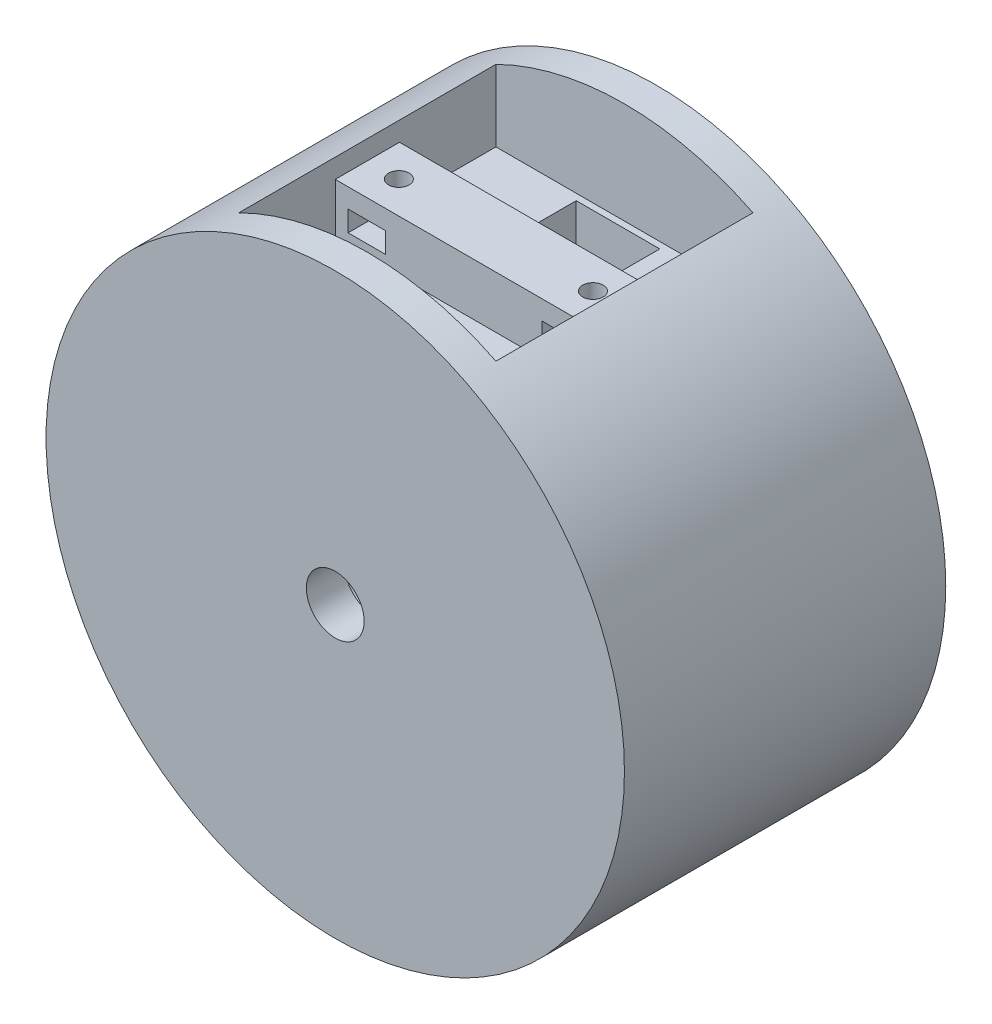
ISO-10303-21;
HEADER;
FILE_DESCRIPTION(('STEP AP214'),'2;1');
FILE_NAME('part.step','',(''),(''),'','','');
FILE_SCHEMA(('AUTOMOTIVE_DESIGN { 1 0 10303 214 1 1 1 1 }'));
ENDSEC;
DATA;
#1=APPLICATION_CONTEXT('core data for automotive mechanical design processes');
#2=APPLICATION_PROTOCOL_DEFINITION('international standard','automotive_design',2000,#1);
#3=PRODUCT_CONTEXT('',#1,'mechanical');
#4=PRODUCT('Part','Part','',(#3));
#5=PRODUCT_RELATED_PRODUCT_CATEGORY('part','',(#4));
#6=PRODUCT_DEFINITION_FORMATION('','',#4);
#7=PRODUCT_DEFINITION_CONTEXT('part definition',#1,'design');
#8=PRODUCT_DEFINITION('design','',#6,#7);
#9=PRODUCT_DEFINITION_SHAPE('','',#8);
#10=(LENGTH_UNIT() NAMED_UNIT(*) SI_UNIT(.MILLI.,.METRE.));
#11=(NAMED_UNIT(*) PLANE_ANGLE_UNIT() SI_UNIT($,.RADIAN.));
#12=(NAMED_UNIT(*) SI_UNIT($,.STERADIAN.) SOLID_ANGLE_UNIT());
#13=UNCERTAINTY_MEASURE_WITH_UNIT(LENGTH_MEASURE(1.E-05),#10,'distance_accuracy_value','');
#14=(GEOMETRIC_REPRESENTATION_CONTEXT(3) GLOBAL_UNCERTAINTY_ASSIGNED_CONTEXT((#13)) GLOBAL_UNIT_ASSIGNED_CONTEXT((#10,
#11,#12)) REPRESENTATION_CONTEXT('',''));
#15=CARTESIAN_POINT('',(0.,0.,0.));
#16=DIRECTION('',(0.,0.,1.));
#17=DIRECTION('',(1.,0.,0.));
#18=AXIS2_PLACEMENT_3D('',#15,#16,#17);
#19=CARTESIAN_POINT('',(0.,0.,50.));
#20=DIRECTION('',(0.,0.,-1.));
#21=DIRECTION('',(-1.,0.,0.));
#22=AXIS2_PLACEMENT_3D('',#19,#20,#21);
#23=CYLINDRICAL_SURFACE('',#22,45.);
#24=CARTESIAN_POINT('',(0.,0.,5.));
#25=DIRECTION('',(0.,0.,-1.));
#26=DIRECTION('',(-1.,0.,0.));
#27=AXIS2_PLACEMENT_3D('',#24,#25,#26);
#28=CIRCLE('',#27,45.);
#29=CARTESIAN_POINT('',(-20.,40.3112887414927,5.));
#30=VERTEX_POINT('',#29);
#31=CARTESIAN_POINT('',(20.,40.3112887414927,5.));
#32=VERTEX_POINT('',#31);
#33=EDGE_CURVE('E11',#30,#32,#28,.T.);
#34=ORIENTED_EDGE('',*,*,#33,.T.);
#35=DIRECTION('',(0.,0.,-1.));
#36=VECTOR('',#35,1.);
#37=CARTESIAN_POINT('',(20.,40.3112887414927,50.));
#38=LINE('',#37,#36);
#39=CARTESIAN_POINT('',(20.,40.3112887414927,45.));
#40=VERTEX_POINT('',#39);
#41=EDGE_CURVE('E396',#32,#40,#38,.F.);
#42=ORIENTED_EDGE('',*,*,#41,.T.);
#43=CARTESIAN_POINT('',(0.,0.,45.));
#44=DIRECTION('',(0.,0.,1.));
#45=DIRECTION('',(1.,0.,0.));
#46=AXIS2_PLACEMENT_3D('',#43,#44,#45);
#47=CIRCLE('',#46,45.);
#48=CARTESIAN_POINT('',(-20.,40.3112887414927,45.));
#49=VERTEX_POINT('',#48);
#50=EDGE_CURVE('E401',#40,#49,#47,.T.);
#51=ORIENTED_EDGE('',*,*,#50,.T.);
#52=DIRECTION('',(0.,0.,-1.));
#53=VECTOR('',#52,1.);
#54=CARTESIAN_POINT('',(-20.,40.3112887414927,50.));
#55=LINE('',#54,#53);
#56=EDGE_CURVE('E41',#49,#30,#55,.T.);
#57=ORIENTED_EDGE('',*,*,#56,.T.);
#58=EDGE_LOOP('',(#34,#42,#51,#57));
#59=FACE_BOUND('',#58,.T.);
#60=CARTESIAN_POINT('',(0.,0.,50.));
#61=DIRECTION('',(0.,0.,1.));
#62=DIRECTION('',(1.,0.,0.));
#63=AXIS2_PLACEMENT_3D('',#60,#61,#62);
#64=CIRCLE('',#63,45.);
#65=CARTESIAN_POINT('',(45.,0.,50.));
#66=VERTEX_POINT('',#65);
#67=EDGE_CURVE('E393',#66,#66,#64,.T.);
#68=ORIENTED_EDGE('',*,*,#67,.F.);
#69=EDGE_LOOP('',(#68));
#70=FACE_BOUND('',#69,.T.);
#71=CARTESIAN_POINT('',(0.,0.,0.));
#72=DIRECTION('',(0.,0.,1.));
#73=DIRECTION('',(1.,0.,0.));
#74=AXIS2_PLACEMENT_3D('',#71,#72,#73);
#75=CIRCLE('',#74,45.);
#76=CARTESIAN_POINT('',(45.,0.,0.));
#77=VERTEX_POINT('',#76);
#78=EDGE_CURVE('E392',#77,#77,#75,.T.);
#79=ORIENTED_EDGE('',*,*,#78,.T.);
#80=EDGE_LOOP('',(#79));
#81=FACE_BOUND('',#80,.T.);
#82=ADVANCED_FACE('F33',(#59,#70,#81),#23,.T.);
#83=CARTESIAN_POINT('',(0.,0.,50.));
#84=DIRECTION('',(0.,0.,1.));
#85=DIRECTION('',(1.,0.,0.));
#86=AXIS2_PLACEMENT_3D('',#83,#84,#85);
#87=PLANE('',#86);
#88=CARTESIAN_POINT('',(0.,0.,50.));
#89=DIRECTION('',(0.,0.,1.));
#90=DIRECTION('',(1.,0.,0.));
#91=AXIS2_PLACEMENT_3D('',#88,#89,#90);
#92=CIRCLE('',#91,4.5);
#93=CARTESIAN_POINT('',(4.5,0.,50.));
#94=VERTEX_POINT('',#93);
#95=EDGE_CURVE('E389',#94,#94,#92,.T.);
#96=ORIENTED_EDGE('',*,*,#95,.F.);
#97=EDGE_LOOP('',(#96));
#98=FACE_BOUND('',#97,.T.);
#99=ORIENTED_EDGE('',*,*,#67,.T.);
#100=EDGE_LOOP('',(#99));
#101=FACE_BOUND('',#100,.T.);
#102=ADVANCED_FACE('F455',(#98,#101),#87,.T.);
#103=CARTESIAN_POINT('',(0.,0.,0.));
#104=DIRECTION('',(0.,0.,1.));
#105=DIRECTION('',(1.,0.,0.));
#106=AXIS2_PLACEMENT_3D('',#103,#104,#105);
#107=PLANE('',#106);
#108=CARTESIAN_POINT('',(0.,0.,0.));
#109=DIRECTION('',(0.,0.,-1.));
#110=DIRECTION('',(-1.,0.,0.));
#111=AXIS2_PLACEMENT_3D('',#108,#109,#110);
#112=CIRCLE('',#111,4.5);
#113=CARTESIAN_POINT('',(-4.5,0.,0.));
#114=VERTEX_POINT('',#113);
#115=EDGE_CURVE('E359',#114,#114,#112,.T.);
#116=ORIENTED_EDGE('',*,*,#115,.F.);
#117=EDGE_LOOP('',(#116));
#118=FACE_BOUND('',#117,.T.);
#119=ORIENTED_EDGE('',*,*,#78,.F.);
#120=EDGE_LOOP('',(#119));
#121=FACE_BOUND('',#120,.T.);
#122=ADVANCED_FACE('F460',(#118,#121),#107,.F.);
#123=CARTESIAN_POINT('',(0.,0.,44.));
#124=DIRECTION('',(0.,0.,1.));
#125=DIRECTION('',(1.,0.,0.));
#126=AXIS2_PLACEMENT_3D('',#123,#124,#125);
#127=CYLINDRICAL_SURFACE('',#126,4.5);
#128=CARTESIAN_POINT('',(0.,0.,44.));
#129=DIRECTION('',(0.,0.,1.));
#130=DIRECTION('',(1.,0.,0.));
#131=AXIS2_PLACEMENT_3D('',#128,#129,#130);
#132=CIRCLE('',#131,4.5);
#133=CARTESIAN_POINT('',(4.5,0.,44.));
#134=VERTEX_POINT('',#133);
#135=EDGE_CURVE('E385',#134,#134,#132,.T.);
#136=ORIENTED_EDGE('',*,*,#135,.F.);
#137=EDGE_LOOP('',(#136));
#138=FACE_BOUND('',#137,.T.);
#139=ORIENTED_EDGE('',*,*,#95,.T.);
#140=EDGE_LOOP('',(#139));
#141=FACE_BOUND('',#140,.T.);
#142=ADVANCED_FACE('F470',(#138,#141),#127,.F.);
#143=CARTESIAN_POINT('',(6.5,7.19,37.));
#144=DIRECTION('',(1.,0.,0.));
#145=DIRECTION('',(0.,0.,-1.));
#146=AXIS2_PLACEMENT_3D('',#143,#144,#145);
#147=PLANE('',#146);
#148=DIRECTION('',(0.,1.,0.));
#149=VECTOR('',#148,1.);
#150=CARTESIAN_POINT('',(6.5,7.19,44.));
#151=LINE('',#150,#149);
#152=CARTESIAN_POINT('',(6.5,-3.07345082927969,44.));
#153=VERTEX_POINT('',#152);
#154=CARTESIAN_POINT('',(6.5,29.19,44.));
#155=VERTEX_POINT('',#154);
#156=EDGE_CURVE('E375',#153,#155,#151,.T.);
#157=ORIENTED_EDGE('',*,*,#156,.T.);
#158=DIRECTION('',(0.,0.,-1.));
#159=VECTOR('',#158,1.);
#160=CARTESIAN_POINT('',(6.5,29.19,44.));
#161=LINE('',#160,#159);
#162=CARTESIAN_POINT('',(6.5,29.19,37.));
#163=VERTEX_POINT('',#162);
#164=EDGE_CURVE('E220',#155,#163,#161,.T.);
#165=ORIENTED_EDGE('',*,*,#164,.T.);
#166=DIRECTION('',(0.,1.,0.));
#167=VECTOR('',#166,1.);
#168=CARTESIAN_POINT('',(6.5,7.19,37.));
#169=LINE('',#168,#167);
#170=CARTESIAN_POINT('',(6.5,-3.07345082927969,37.));
#171=VERTEX_POINT('',#170);
#172=EDGE_CURVE('E378',#171,#163,#169,.T.);
#173=ORIENTED_EDGE('',*,*,#172,.F.);
#174=DIRECTION('',(0.,0.,1.));
#175=VECTOR('',#174,1.);
#176=CARTESIAN_POINT('',(6.5,-3.07345082927969,37.));
#177=LINE('',#176,#175);
#178=EDGE_CURVE('E383',#171,#153,#177,.T.);
#179=ORIENTED_EDGE('',*,*,#178,.T.);
#180=EDGE_LOOP('',(#157,#165,#173,#179));
#181=FACE_BOUND('',#180,.T.);
#182=ADVANCED_FACE('F475',(#181),#147,.F.);
#183=CARTESIAN_POINT('',(0.,0.,37.));
#184=DIRECTION('',(0.,0.,1.));
#185=DIRECTION('',(1.,0.,0.));
#186=AXIS2_PLACEMENT_3D('',#183,#184,#185);
#187=CYLINDRICAL_SURFACE('',#186,7.19);
#188=CARTESIAN_POINT('',(0.,0.,44.));
#189=DIRECTION('',(0.,0.,1.));
#190=DIRECTION('',(1.,0.,0.));
#191=AXIS2_PLACEMENT_3D('',#188,#189,#190);
#192=CIRCLE('',#191,7.19);
#193=CARTESIAN_POINT('',(-6.5,-3.07345082927969,44.));
#194=VERTEX_POINT('',#193);
#195=EDGE_CURVE('E204',#194,#153,#192,.T.);
#196=ORIENTED_EDGE('',*,*,#195,.T.);
#197=ORIENTED_EDGE('',*,*,#178,.F.);
#198=CARTESIAN_POINT('',(0.,0.,37.));
#199=DIRECTION('',(0.,0.,1.));
#200=DIRECTION('',(1.,0.,0.));
#201=AXIS2_PLACEMENT_3D('',#198,#199,#200);
#202=CIRCLE('',#201,7.19);
#203=CARTESIAN_POINT('',(-6.5,-3.07345082927969,37.));
#204=VERTEX_POINT('',#203);
#205=EDGE_CURVE('E374',#204,#171,#202,.T.);
#206=ORIENTED_EDGE('',*,*,#205,.F.);
#207=DIRECTION('',(0.,0.,1.));
#208=VECTOR('',#207,1.);
#209=CARTESIAN_POINT('',(-6.5,-3.07345082927969,37.));
#210=LINE('',#209,#208);
#211=EDGE_CURVE('E379',#204,#194,#210,.T.);
#212=ORIENTED_EDGE('',*,*,#211,.T.);
#213=EDGE_LOOP('',(#196,#197,#206,#212));
#214=FACE_BOUND('',#213,.T.);
#215=ADVANCED_FACE('F483',(#214),#187,.F.);
#216=CARTESIAN_POINT('',(-6.5,-3.07345082927969,37.));
#217=DIRECTION('',(-1.,0.,0.));
#218=DIRECTION('',(0.,0.,1.));
#219=AXIS2_PLACEMENT_3D('',#216,#217,#218);
#220=PLANE('',#219);
#221=DIRECTION('',(0.,-1.,0.));
#222=VECTOR('',#221,1.);
#223=CARTESIAN_POINT('',(-6.5,-3.07345082927969,44.));
#224=LINE('',#223,#222);
#225=CARTESIAN_POINT('',(-6.5,29.19,44.));
#226=VERTEX_POINT('',#225);
#227=EDGE_CURVE('E196',#226,#194,#224,.T.);
#228=ORIENTED_EDGE('',*,*,#227,.T.);
#229=ORIENTED_EDGE('',*,*,#211,.F.);
#230=DIRECTION('',(0.,-1.,0.));
#231=VECTOR('',#230,1.);
#232=CARTESIAN_POINT('',(-6.5,-3.07345082927969,37.));
#233=LINE('',#232,#231);
#234=CARTESIAN_POINT('',(-6.5,29.19,37.));
#235=VERTEX_POINT('',#234);
#236=EDGE_CURVE('E212',#235,#204,#233,.T.);
#237=ORIENTED_EDGE('',*,*,#236,.F.);
#238=DIRECTION('',(0.,0.,1.));
#239=VECTOR('',#238,1.);
#240=CARTESIAN_POINT('',(-6.5,29.19,44.));
#241=LINE('',#240,#239);
#242=EDGE_CURVE('E209',#235,#226,#241,.T.);
#243=ORIENTED_EDGE('',*,*,#242,.T.);
#244=EDGE_LOOP('',(#228,#229,#237,#243));
#245=FACE_BOUND('',#244,.T.);
#246=ADVANCED_FACE('F210',(#245),#220,.F.);
#247=CARTESIAN_POINT('',(0.,0.,37.));
#248=DIRECTION('',(0.,0.,1.));
#249=DIRECTION('',(1.,0.,0.));
#250=AXIS2_PLACEMENT_3D('',#247,#248,#249);
#251=PLANE('',#250);
#252=CARTESIAN_POINT('',(0.,0.,37.));
#253=DIRECTION('',(0.,0.,1.));
#254=DIRECTION('',(1.,0.,0.));
#255=AXIS2_PLACEMENT_3D('',#252,#253,#254);
#256=CIRCLE('',#255,4.5);
#257=CARTESIAN_POINT('',(4.5,0.,37.));
#258=VERTEX_POINT('',#257);
#259=EDGE_CURVE('E428',#258,#258,#256,.T.);
#260=ORIENTED_EDGE('',*,*,#259,.F.);
#261=EDGE_LOOP('',(#260));
#262=FACE_BOUND('',#261,.T.);
#263=ORIENTED_EDGE('',*,*,#172,.T.);
#264=DIRECTION('',(-1.,0.,0.));
#265=VECTOR('',#264,1.);
#266=CARTESIAN_POINT('',(-6.5,29.19,37.));
#267=LINE('',#266,#265);
#268=EDGE_CURVE('E222',#163,#235,#267,.T.);
#269=ORIENTED_EDGE('',*,*,#268,.T.);
#270=ORIENTED_EDGE('',*,*,#236,.T.);
#271=ORIENTED_EDGE('',*,*,#205,.T.);
#272=EDGE_LOOP('',(#263,#269,#270,#271));
#273=FACE_BOUND('',#272,.T.);
#274=ADVANCED_FACE('F482',(#262,#273),#251,.T.);
#275=CARTESIAN_POINT('',(0.,0.,44.));
#276=DIRECTION('',(0.,0.,1.));
#277=DIRECTION('',(1.,0.,0.));
#278=AXIS2_PLACEMENT_3D('',#275,#276,#277);
#279=PLANE('',#278);
#280=ORIENTED_EDGE('',*,*,#135,.T.);
#281=EDGE_LOOP('',(#280));
#282=FACE_BOUND('',#281,.T.);
#283=ORIENTED_EDGE('',*,*,#227,.F.);
#284=DIRECTION('',(1.,0.,0.));
#285=VECTOR('',#284,1.);
#286=CARTESIAN_POINT('',(-6.5,29.19,44.));
#287=LINE('',#286,#285);
#288=EDGE_CURVE('E201',#226,#155,#287,.T.);
#289=ORIENTED_EDGE('',*,*,#288,.T.);
#290=ORIENTED_EDGE('',*,*,#156,.F.);
#291=ORIENTED_EDGE('',*,*,#195,.F.);
#292=EDGE_LOOP('',(#283,#289,#290,#291));
#293=FACE_BOUND('',#292,.T.);
#294=ADVANCED_FACE('F198',(#282,#293),#279,.F.);
#295=CARTESIAN_POINT('',(-20.,48.19,30.));
#296=DIRECTION('',(-1.,0.,0.));
#297=DIRECTION('',(0.,0.,1.));
#298=AXIS2_PLACEMENT_3D('',#295,#296,#297);
#299=PLANE('',#298);
#300=DIRECTION('',(0.,-1.,0.));
#301=VECTOR('',#300,1.);
#302=CARTESIAN_POINT('',(-20.,48.19,45.));
#303=LINE('',#302,#301);
#304=CARTESIAN_POINT('',(-20.,29.19,45.));
#305=VERTEX_POINT('',#304);
#306=EDGE_CURVE('E206',#49,#305,#303,.T.);
#307=ORIENTED_EDGE('',*,*,#306,.T.);
#308=DIRECTION('',(0.,0.,1.));
#309=VECTOR('',#308,1.);
#310=CARTESIAN_POINT('',(-20.,29.19,45.));
#311=LINE('',#310,#309);
#312=CARTESIAN_POINT('',(-20.,29.19,30.));
#313=VERTEX_POINT('',#312);
#314=EDGE_CURVE('E230',#313,#305,#311,.T.);
#315=ORIENTED_EDGE('',*,*,#314,.F.);
#316=DIRECTION('',(0.,-1.,0.));
#317=VECTOR('',#316,1.);
#318=CARTESIAN_POINT('',(-20.,48.19,30.));
#319=LINE('',#318,#317);
#320=CARTESIAN_POINT('',(-20.,37.3112887414927,30.));
#321=VERTEX_POINT('',#320);
#322=EDGE_CURVE('E362',#321,#313,#319,.T.);
#323=ORIENTED_EDGE('',*,*,#322,.F.);
#324=DIRECTION('',(0.,0.,1.));
#325=VECTOR('',#324,1.);
#326=CARTESIAN_POINT('',(-20.,37.3112887414927,-0.001000000000001));
#327=LINE('',#326,#325);
#328=CARTESIAN_POINT('',(-20.,37.3112887414927,20.));
#329=VERTEX_POINT('',#328);
#330=EDGE_CURVE('E318',#329,#321,#327,.T.);
#331=ORIENTED_EDGE('',*,*,#330,.F.);
#332=DIRECTION('',(0.,-1.,0.));
#333=VECTOR('',#332,1.);
#334=CARTESIAN_POINT('',(-20.,54.19,20.));
#335=LINE('',#334,#333);
#336=CARTESIAN_POINT('',(-20.,29.19,20.));
#337=VERTEX_POINT('',#336);
#338=EDGE_CURVE('E332',#329,#337,#335,.T.);
#339=ORIENTED_EDGE('',*,*,#338,.T.);
#340=DIRECTION('',(0.,0.,1.));
#341=VECTOR('',#340,1.);
#342=CARTESIAN_POINT('',(-20.,29.19,5.));
#343=LINE('',#342,#341);
#344=CARTESIAN_POINT('',(-20.,29.19,5.));
#345=VERTEX_POINT('',#344);
#346=EDGE_CURVE('E57',#345,#337,#343,.T.);
#347=ORIENTED_EDGE('',*,*,#346,.F.);
#348=DIRECTION('',(0.,-1.,0.));
#349=VECTOR('',#348,1.);
#350=CARTESIAN_POINT('',(-20.,54.19,5.));
#351=LINE('',#350,#349);
#352=EDGE_CURVE('E329',#30,#345,#351,.T.);
#353=ORIENTED_EDGE('',*,*,#352,.F.);
#354=ORIENTED_EDGE('',*,*,#56,.F.);
#355=EDGE_LOOP('',(#307,#315,#323,#331,#339,#347,#353,#354));
#356=FACE_BOUND('',#355,.T.);
#357=ADVANCED_FACE('F492',(#356),#299,.F.);
#358=CARTESIAN_POINT('',(20.,48.19,45.));
#359=DIRECTION('',(0.,0.,1.));
#360=DIRECTION('',(1.,0.,0.));
#361=AXIS2_PLACEMENT_3D('',#358,#359,#360);
#362=PLANE('',#361);
#363=DIRECTION('',(0.,-1.,0.));
#364=VECTOR('',#363,1.);
#365=CARTESIAN_POINT('',(20.,48.19,45.));
#366=LINE('',#365,#364);
#367=CARTESIAN_POINT('',(20.,29.19,45.));
#368=VERTEX_POINT('',#367);
#369=EDGE_CURVE('E365',#40,#368,#366,.T.);
#370=ORIENTED_EDGE('',*,*,#369,.T.);
#371=DIRECTION('',(1.,0.,0.));
#372=VECTOR('',#371,1.);
#373=CARTESIAN_POINT('',(20.,29.19,45.));
#374=LINE('',#373,#372);
#375=EDGE_CURVE('E232',#305,#368,#374,.T.);
#376=ORIENTED_EDGE('',*,*,#375,.F.);
#377=ORIENTED_EDGE('',*,*,#306,.F.);
#378=ORIENTED_EDGE('',*,*,#50,.F.);
#379=EDGE_LOOP('',(#370,#376,#377,#378));
#380=FACE_BOUND('',#379,.T.);
#381=ADVANCED_FACE('F499',(#380),#362,.F.);
#382=CARTESIAN_POINT('',(20.,48.19,30.));
#383=DIRECTION('',(1.,0.,0.));
#384=DIRECTION('',(0.,0.,-1.));
#385=AXIS2_PLACEMENT_3D('',#382,#383,#384);
#386=PLANE('',#385);
#387=DIRECTION('',(0.,-1.,0.));
#388=VECTOR('',#387,1.);
#389=CARTESIAN_POINT('',(20.,48.19,30.));
#390=LINE('',#389,#388);
#391=CARTESIAN_POINT('',(20.,37.3112887414927,30.));
#392=VERTEX_POINT('',#391);
#393=CARTESIAN_POINT('',(20.,29.19,30.));
#394=VERTEX_POINT('',#393);
#395=EDGE_CURVE('E368',#392,#394,#390,.T.);
#396=ORIENTED_EDGE('',*,*,#395,.T.);
#397=DIRECTION('',(0.,0.,-1.));
#398=VECTOR('',#397,1.);
#399=CARTESIAN_POINT('',(20.,29.19,45.));
#400=LINE('',#399,#398);
#401=EDGE_CURVE('E49',#368,#394,#400,.T.);
#402=ORIENTED_EDGE('',*,*,#401,.F.);
#403=ORIENTED_EDGE('',*,*,#369,.F.);
#404=ORIENTED_EDGE('',*,*,#41,.F.);
#405=DIRECTION('',(0.,-1.,0.));
#406=VECTOR('',#405,1.);
#407=CARTESIAN_POINT('',(20.,54.19,5.));
#408=LINE('',#407,#406);
#409=CARTESIAN_POINT('',(20.,29.19,5.));
#410=VERTEX_POINT('',#409);
#411=EDGE_CURVE('E325',#32,#410,#408,.T.);
#412=ORIENTED_EDGE('',*,*,#411,.T.);
#413=DIRECTION('',(0.,0.,-1.));
#414=VECTOR('',#413,1.);
#415=CARTESIAN_POINT('',(20.,29.19,5.));
#416=LINE('',#415,#414);
#417=CARTESIAN_POINT('',(20.,29.19,20.));
#418=VERTEX_POINT('',#417);
#419=EDGE_CURVE('E249',#418,#410,#416,.T.);
#420=ORIENTED_EDGE('',*,*,#419,.F.);
#421=DIRECTION('',(0.,-1.,0.));
#422=VECTOR('',#421,1.);
#423=CARTESIAN_POINT('',(20.,54.19,20.));
#424=LINE('',#423,#422);
#425=CARTESIAN_POINT('',(20.,37.3112887414927,20.));
#426=VERTEX_POINT('',#425);
#427=EDGE_CURVE('E324',#426,#418,#424,.T.);
#428=ORIENTED_EDGE('',*,*,#427,.F.);
#429=DIRECTION('',(0.,0.,1.));
#430=VECTOR('',#429,1.);
#431=CARTESIAN_POINT('',(20.,37.3112887414927,-0.001000000000001));
#432=LINE('',#431,#430);
#433=EDGE_CURVE('E319',#426,#392,#432,.T.);
#434=ORIENTED_EDGE('',*,*,#433,.T.);
#435=EDGE_LOOP('',(#396,#402,#403,#404,#412,#420,#428,#434));
#436=FACE_BOUND('',#435,.T.);
#437=ADVANCED_FACE('F505',(#436),#386,.F.);
#438=CARTESIAN_POINT('',(20.,48.19,30.));
#439=DIRECTION('',(0.,0.,-1.));
#440=DIRECTION('',(-1.,0.,0.));
#441=AXIS2_PLACEMENT_3D('',#438,#439,#440);
#442=PLANE('',#441);
#443=DIRECTION('',(0.,1.,0.));
#444=VECTOR('',#443,1.);
#445=CARTESIAN_POINT('',(18.,31.1112887414927,30.));
#446=LINE('',#445,#444);
#447=CARTESIAN_POINT('',(18.,31.1112887414927,30.));
#448=VERTEX_POINT('',#447);
#449=CARTESIAN_POINT('',(18.,34.3112887414927,30.));
#450=VERTEX_POINT('',#449);
#451=EDGE_CURVE('E256',#448,#450,#446,.T.);
#452=ORIENTED_EDGE('',*,*,#451,.F.);
#453=DIRECTION('',(1.,0.,0.));
#454=VECTOR('',#453,1.);
#455=CARTESIAN_POINT('',(12.2,31.1112887414927,30.));
#456=LINE('',#455,#454);
#457=CARTESIAN_POINT('',(12.2,31.1112887414927,30.));
#458=VERTEX_POINT('',#457);
#459=EDGE_CURVE('E254',#458,#448,#456,.T.);
#460=ORIENTED_EDGE('',*,*,#459,.F.);
#461=DIRECTION('',(0.,-1.,0.));
#462=VECTOR('',#461,1.);
#463=CARTESIAN_POINT('',(12.2,31.1112887414927,30.));
#464=LINE('',#463,#462);
#465=CARTESIAN_POINT('',(12.2,34.3112887414927,30.));
#466=VERTEX_POINT('',#465);
#467=EDGE_CURVE('E270',#466,#458,#464,.T.);
#468=ORIENTED_EDGE('',*,*,#467,.F.);
#469=DIRECTION('',(-1.,0.,0.));
#470=VECTOR('',#469,1.);
#471=CARTESIAN_POINT('',(12.2,34.3112887414927,30.));
#472=LINE('',#471,#470);
#473=EDGE_CURVE('E273',#450,#466,#472,.T.);
#474=ORIENTED_EDGE('',*,*,#473,.F.);
#475=EDGE_LOOP('',(#452,#460,#468,#474));
#476=FACE_BOUND('',#475,.T.);
#477=DIRECTION('',(0.,1.,0.));
#478=VECTOR('',#477,1.);
#479=CARTESIAN_POINT('',(-12.2,31.1112887414927,30.));
#480=LINE('',#479,#478);
#481=CARTESIAN_POINT('',(-12.2,31.1112887414927,30.));
#482=VERTEX_POINT('',#481);
#483=CARTESIAN_POINT('',(-12.2,34.3112887414927,30.));
#484=VERTEX_POINT('',#483);
#485=EDGE_CURVE('E288',#482,#484,#480,.T.);
#486=ORIENTED_EDGE('',*,*,#485,.F.);
#487=DIRECTION('',(1.,0.,0.));
#488=VECTOR('',#487,1.);
#489=CARTESIAN_POINT('',(-18.,31.1112887414927,30.));
#490=LINE('',#489,#488);
#491=CARTESIAN_POINT('',(-18.,31.1112887414927,30.));
#492=VERTEX_POINT('',#491);
#493=EDGE_CURVE('E253',#492,#482,#490,.T.);
#494=ORIENTED_EDGE('',*,*,#493,.F.);
#495=DIRECTION('',(0.,-1.,0.));
#496=VECTOR('',#495,1.);
#497=CARTESIAN_POINT('',(-18.,31.1112887414927,30.));
#498=LINE('',#497,#496);
#499=CARTESIAN_POINT('',(-18.,34.3112887414927,30.));
#500=VERTEX_POINT('',#499);
#501=EDGE_CURVE('E301',#500,#492,#498,.T.);
#502=ORIENTED_EDGE('',*,*,#501,.F.);
#503=DIRECTION('',(-1.,0.,0.));
#504=VECTOR('',#503,1.);
#505=CARTESIAN_POINT('',(-18.,34.3112887414927,30.));
#506=LINE('',#505,#504);
#507=EDGE_CURVE('E304',#484,#500,#506,.T.);
#508=ORIENTED_EDGE('',*,*,#507,.F.);
#509=EDGE_LOOP('',(#486,#494,#502,#508));
#510=FACE_BOUND('',#509,.T.);
#511=ORIENTED_EDGE('',*,*,#322,.T.);
#512=DIRECTION('',(-1.,0.,0.));
#513=VECTOR('',#512,1.);
#514=CARTESIAN_POINT('',(20.,29.19,30.));
#515=LINE('',#514,#513);
#516=EDGE_CURVE('E228',#394,#313,#515,.T.);
#517=ORIENTED_EDGE('',*,*,#516,.F.);
#518=ORIENTED_EDGE('',*,*,#395,.F.);
#519=DIRECTION('',(1.,0.,0.));
#520=VECTOR('',#519,1.);
#521=CARTESIAN_POINT('',(-20.,37.3112887414927,30.));
#522=LINE('',#521,#520);
#523=EDGE_CURVE('E286',#321,#392,#522,.T.);
#524=ORIENTED_EDGE('',*,*,#523,.F.);
#525=EDGE_LOOP('',(#511,#517,#518,#524));
#526=FACE_BOUND('',#525,.T.);
#527=ADVANCED_FACE('F501',(#476,#510,#526),#442,.F.);
#528=CARTESIAN_POINT('',(0.,0.,6.));
#529=DIRECTION('',(0.,0.,-1.));
#530=DIRECTION('',(-1.,0.,0.));
#531=AXIS2_PLACEMENT_3D('',#528,#529,#530);
#532=CYLINDRICAL_SURFACE('',#531,4.5);
#533=CARTESIAN_POINT('',(0.,0.,6.));
#534=DIRECTION('',(0.,0.,-1.));
#535=DIRECTION('',(-1.,0.,0.));
#536=AXIS2_PLACEMENT_3D('',#533,#534,#535);
#537=CIRCLE('',#536,4.5);
#538=CARTESIAN_POINT('',(-4.5,0.,6.));
#539=VERTEX_POINT('',#538);
#540=EDGE_CURVE('E355',#539,#539,#537,.T.);
#541=ORIENTED_EDGE('',*,*,#540,.F.);
#542=EDGE_LOOP('',(#541));
#543=FACE_BOUND('',#542,.T.);
#544=ORIENTED_EDGE('',*,*,#115,.T.);
#545=EDGE_LOOP('',(#544));
#546=FACE_BOUND('',#545,.T.);
#547=ADVANCED_FACE('F504',(#543,#546),#532,.F.);
#548=CARTESIAN_POINT('',(0.,0.,13.));
#549=DIRECTION('',(0.,0.,-1.));
#550=DIRECTION('',(-1.,0.,0.));
#551=AXIS2_PLACEMENT_3D('',#548,#549,#550);
#552=CYLINDRICAL_SURFACE('',#551,7.19);
#553=CARTESIAN_POINT('',(0.,0.,6.));
#554=DIRECTION('',(0.,0.,-1.));
#555=DIRECTION('',(-1.,0.,0.));
#556=AXIS2_PLACEMENT_3D('',#553,#554,#555);
#557=CIRCLE('',#556,7.19);
#558=CARTESIAN_POINT('',(6.5,-3.07345082927969,6.));
#559=VERTEX_POINT('',#558);
#560=CARTESIAN_POINT('',(-6.5,-3.07345082927969,6.));
#561=VERTEX_POINT('',#560);
#562=EDGE_CURVE('E328',#559,#561,#557,.T.);
#563=ORIENTED_EDGE('',*,*,#562,.T.);
#564=DIRECTION('',(0.,0.,-1.));
#565=VECTOR('',#564,1.);
#566=CARTESIAN_POINT('',(-6.5,-3.07345082927969,13.));
#567=LINE('',#566,#565);
#568=CARTESIAN_POINT('',(-6.5,-3.07345082927969,13.));
#569=VERTEX_POINT('',#568);
#570=EDGE_CURVE('E346',#569,#561,#567,.T.);
#571=ORIENTED_EDGE('',*,*,#570,.F.);
#572=CARTESIAN_POINT('',(0.,0.,13.));
#573=DIRECTION('',(0.,0.,-1.));
#574=DIRECTION('',(-1.,0.,0.));
#575=AXIS2_PLACEMENT_3D('',#572,#573,#574);
#576=CIRCLE('',#575,7.19);
#577=CARTESIAN_POINT('',(6.5,-3.07345082927969,13.));
#578=VERTEX_POINT('',#577);
#579=EDGE_CURVE('E337',#578,#569,#576,.T.);
#580=ORIENTED_EDGE('',*,*,#579,.F.);
#581=DIRECTION('',(0.,0.,-1.));
#582=VECTOR('',#581,1.);
#583=CARTESIAN_POINT('',(6.5,-3.07345082927969,13.));
#584=LINE('',#583,#582);
#585=EDGE_CURVE('E353',#578,#559,#584,.T.);
#586=ORIENTED_EDGE('',*,*,#585,.T.);
#587=EDGE_LOOP('',(#563,#571,#580,#586));
#588=FACE_BOUND('',#587,.T.);
#589=ADVANCED_FACE('F515',(#588),#552,.F.);
#590=CARTESIAN_POINT('',(6.5,-3.07345082927969,13.));
#591=DIRECTION('',(1.,0.,0.));
#592=DIRECTION('',(0.,0.,-1.));
#593=AXIS2_PLACEMENT_3D('',#590,#591,#592);
#594=PLANE('',#593);
#595=DIRECTION('',(0.,-1.,0.));
#596=VECTOR('',#595,1.);
#597=CARTESIAN_POINT('',(6.5,-3.07345082927969,6.));
#598=LINE('',#597,#596);
#599=CARTESIAN_POINT('',(6.5,29.19,6.));
#600=VERTEX_POINT('',#599);
#601=EDGE_CURVE('E341',#600,#559,#598,.T.);
#602=ORIENTED_EDGE('',*,*,#601,.T.);
#603=ORIENTED_EDGE('',*,*,#585,.F.);
#604=DIRECTION('',(0.,-1.,0.));
#605=VECTOR('',#604,1.);
#606=CARTESIAN_POINT('',(6.5,-3.07345082927969,13.));
#607=LINE('',#606,#605);
#608=CARTESIAN_POINT('',(6.5,29.19,13.));
#609=VERTEX_POINT('',#608);
#610=EDGE_CURVE('E343',#609,#578,#607,.T.);
#611=ORIENTED_EDGE('',*,*,#610,.F.);
#612=DIRECTION('',(0.,0.,-1.));
#613=VECTOR('',#612,1.);
#614=CARTESIAN_POINT('',(6.5,29.19,13.));
#615=LINE('',#614,#613);
#616=EDGE_CURVE('E240',#609,#600,#615,.T.);
#617=ORIENTED_EDGE('',*,*,#616,.T.);
#618=EDGE_LOOP('',(#602,#603,#611,#617));
#619=FACE_BOUND('',#618,.T.);
#620=ADVANCED_FACE('F519',(#619),#594,.F.);
#621=CARTESIAN_POINT('',(-6.5,7.19,13.));
#622=DIRECTION('',(-1.,0.,0.));
#623=DIRECTION('',(0.,0.,1.));
#624=AXIS2_PLACEMENT_3D('',#621,#622,#623);
#625=PLANE('',#624);
#626=DIRECTION('',(0.,1.,0.));
#627=VECTOR('',#626,1.);
#628=CARTESIAN_POINT('',(-6.5,7.19,6.));
#629=LINE('',#628,#627);
#630=CARTESIAN_POINT('',(-6.5,29.19,6.));
#631=VERTEX_POINT('',#630);
#632=EDGE_CURVE('E349',#561,#631,#629,.T.);
#633=ORIENTED_EDGE('',*,*,#632,.T.);
#634=DIRECTION('',(0.,0.,1.));
#635=VECTOR('',#634,1.);
#636=CARTESIAN_POINT('',(-6.5,29.19,13.));
#637=LINE('',#636,#635);
#638=CARTESIAN_POINT('',(-6.5,29.19,13.));
#639=VERTEX_POINT('',#638);
#640=EDGE_CURVE('E234',#631,#639,#637,.T.);
#641=ORIENTED_EDGE('',*,*,#640,.T.);
#642=DIRECTION('',(0.,1.,0.));
#643=VECTOR('',#642,1.);
#644=CARTESIAN_POINT('',(-6.5,7.19,13.));
#645=LINE('',#644,#643);
#646=EDGE_CURVE('E340',#569,#639,#645,.T.);
#647=ORIENTED_EDGE('',*,*,#646,.F.);
#648=ORIENTED_EDGE('',*,*,#570,.T.);
#649=EDGE_LOOP('',(#633,#641,#647,#648));
#650=FACE_BOUND('',#649,.T.);
#651=ADVANCED_FACE('F521',(#650),#625,.F.);
#652=CARTESIAN_POINT('',(0.,0.,13.));
#653=DIRECTION('',(0.,0.,-1.));
#654=DIRECTION('',(-1.,0.,0.));
#655=AXIS2_PLACEMENT_3D('',#652,#653,#654);
#656=PLANE('',#655);
#657=CARTESIAN_POINT('',(0.,0.,13.));
#658=DIRECTION('',(0.,0.,-1.));
#659=DIRECTION('',(-1.,0.,0.));
#660=AXIS2_PLACEMENT_3D('',#657,#658,#659);
#661=CIRCLE('',#660,4.5);
#662=CARTESIAN_POINT('',(-4.5,0.,13.));
#663=VERTEX_POINT('',#662);
#664=EDGE_CURVE('E421',#663,#663,#661,.F.);
#665=ORIENTED_EDGE('',*,*,#664,.T.);
#666=EDGE_LOOP('',(#665));
#667=FACE_BOUND('',#666,.T.);
#668=ORIENTED_EDGE('',*,*,#579,.T.);
#669=ORIENTED_EDGE('',*,*,#646,.T.);
#670=DIRECTION('',(1.,0.,0.));
#671=VECTOR('',#670,1.);
#672=CARTESIAN_POINT('',(-6.5,29.19,13.));
#673=LINE('',#672,#671);
#674=EDGE_CURVE('E237',#639,#609,#673,.T.);
#675=ORIENTED_EDGE('',*,*,#674,.T.);
#676=ORIENTED_EDGE('',*,*,#610,.T.);
#677=EDGE_LOOP('',(#668,#669,#675,#676));
#678=FACE_BOUND('',#677,.T.);
#679=ADVANCED_FACE('F524',(#667,#678),#656,.T.);
#680=CARTESIAN_POINT('',(0.,0.,6.));
#681=DIRECTION('',(0.,0.,-1.));
#682=DIRECTION('',(-1.,0.,0.));
#683=AXIS2_PLACEMENT_3D('',#680,#681,#682);
#684=PLANE('',#683);
#685=ORIENTED_EDGE('',*,*,#540,.T.);
#686=EDGE_LOOP('',(#685));
#687=FACE_BOUND('',#686,.T.);
#688=ORIENTED_EDGE('',*,*,#562,.F.);
#689=ORIENTED_EDGE('',*,*,#601,.F.);
#690=DIRECTION('',(-1.,0.,0.));
#691=VECTOR('',#690,1.);
#692=CARTESIAN_POINT('',(-6.5,29.19,6.));
#693=LINE('',#692,#691);
#694=EDGE_CURVE('E243',#600,#631,#693,.T.);
#695=ORIENTED_EDGE('',*,*,#694,.T.);
#696=ORIENTED_EDGE('',*,*,#632,.F.);
#697=EDGE_LOOP('',(#688,#689,#695,#696));
#698=FACE_BOUND('',#697,.T.);
#699=ADVANCED_FACE('F529',(#687,#698),#684,.F.);
#700=CARTESIAN_POINT('',(-20.,54.19,5.));
#701=DIRECTION('',(0.,0.,-1.));
#702=DIRECTION('',(-1.,0.,0.));
#703=AXIS2_PLACEMENT_3D('',#700,#701,#702);
#704=PLANE('',#703);
#705=ORIENTED_EDGE('',*,*,#352,.T.);
#706=DIRECTION('',(-1.,0.,0.));
#707=VECTOR('',#706,1.);
#708=CARTESIAN_POINT('',(-20.,29.19,5.));
#709=LINE('',#708,#707);
#710=EDGE_CURVE('E251',#410,#345,#709,.T.);
#711=ORIENTED_EDGE('',*,*,#710,.F.);
#712=ORIENTED_EDGE('',*,*,#411,.F.);
#713=ORIENTED_EDGE('',*,*,#33,.F.);
#714=EDGE_LOOP('',(#705,#711,#712,#713));
#715=FACE_BOUND('',#714,.T.);
#716=ADVANCED_FACE('F532',(#715),#704,.F.);
#717=CARTESIAN_POINT('',(-20.,54.19,20.));
#718=DIRECTION('',(0.,0.,1.));
#719=DIRECTION('',(1.,0.,0.));
#720=AXIS2_PLACEMENT_3D('',#717,#718,#719);
#721=PLANE('',#720);
#722=DIRECTION('',(0.,1.,0.));
#723=VECTOR('',#722,1.);
#724=CARTESIAN_POINT('',(12.2,31.1112887414927,20.));
#725=LINE('',#724,#723);
#726=CARTESIAN_POINT('',(12.2,31.1112887414927,20.));
#727=VERTEX_POINT('',#726);
#728=CARTESIAN_POINT('',(12.2,34.3112887414927,20.));
#729=VERTEX_POINT('',#728);
#730=EDGE_CURVE('E261',#727,#729,#725,.T.);
#731=ORIENTED_EDGE('',*,*,#730,.F.);
#732=DIRECTION('',(-1.,0.,0.));
#733=VECTOR('',#732,1.);
#734=CARTESIAN_POINT('',(12.2,31.1112887414927,20.));
#735=LINE('',#734,#733);
#736=CARTESIAN_POINT('',(18.,31.1112887414927,20.));
#737=VERTEX_POINT('',#736);
#738=EDGE_CURVE('E264',#737,#727,#735,.T.);
#739=ORIENTED_EDGE('',*,*,#738,.F.);
#740=DIRECTION('',(0.,-1.,0.));
#741=VECTOR('',#740,1.);
#742=CARTESIAN_POINT('',(18.,31.1112887414927,20.));
#743=LINE('',#742,#741);
#744=CARTESIAN_POINT('',(18.,34.3112887414927,20.));
#745=VERTEX_POINT('',#744);
#746=EDGE_CURVE('E267',#745,#737,#743,.T.);
#747=ORIENTED_EDGE('',*,*,#746,.F.);
#748=DIRECTION('',(1.,0.,0.));
#749=VECTOR('',#748,1.);
#750=CARTESIAN_POINT('',(12.2,34.3112887414927,20.));
#751=LINE('',#750,#749);
#752=EDGE_CURVE('E258',#729,#745,#751,.T.);
#753=ORIENTED_EDGE('',*,*,#752,.F.);
#754=EDGE_LOOP('',(#731,#739,#747,#753));
#755=FACE_BOUND('',#754,.T.);
#756=DIRECTION('',(0.,1.,0.));
#757=VECTOR('',#756,1.);
#758=CARTESIAN_POINT('',(-18.,31.1112887414927,20.));
#759=LINE('',#758,#757);
#760=CARTESIAN_POINT('',(-18.,31.1112887414927,20.));
#761=VERTEX_POINT('',#760);
#762=CARTESIAN_POINT('',(-18.,34.3112887414927,20.));
#763=VERTEX_POINT('',#762);
#764=EDGE_CURVE('E292',#761,#763,#759,.T.);
#765=ORIENTED_EDGE('',*,*,#764,.F.);
#766=DIRECTION('',(-1.,0.,0.));
#767=VECTOR('',#766,1.);
#768=CARTESIAN_POINT('',(-18.,31.1112887414927,20.));
#769=LINE('',#768,#767);
#770=CARTESIAN_POINT('',(-12.2,31.1112887414927,20.));
#771=VERTEX_POINT('',#770);
#772=EDGE_CURVE('E295',#771,#761,#769,.T.);
#773=ORIENTED_EDGE('',*,*,#772,.F.);
#774=DIRECTION('',(0.,-1.,0.));
#775=VECTOR('',#774,1.);
#776=CARTESIAN_POINT('',(-12.2,31.1112887414927,20.));
#777=LINE('',#776,#775);
#778=CARTESIAN_POINT('',(-12.2,34.3112887414927,20.));
#779=VERTEX_POINT('',#778);
#780=EDGE_CURVE('E298',#779,#771,#777,.T.);
#781=ORIENTED_EDGE('',*,*,#780,.F.);
#782=DIRECTION('',(1.,0.,0.));
#783=VECTOR('',#782,1.);
#784=CARTESIAN_POINT('',(-18.,34.3112887414927,20.));
#785=LINE('',#784,#783);
#786=EDGE_CURVE('E289',#763,#779,#785,.T.);
#787=ORIENTED_EDGE('',*,*,#786,.F.);
#788=EDGE_LOOP('',(#765,#773,#781,#787));
#789=FACE_BOUND('',#788,.T.);
#790=ORIENTED_EDGE('',*,*,#427,.T.);
#791=DIRECTION('',(1.,0.,0.));
#792=VECTOR('',#791,1.);
#793=CARTESIAN_POINT('',(-20.,29.19,20.));
#794=LINE('',#793,#792);
#795=EDGE_CURVE('E247',#337,#418,#794,.T.);
#796=ORIENTED_EDGE('',*,*,#795,.F.);
#797=ORIENTED_EDGE('',*,*,#338,.F.);
#798=DIRECTION('',(-1.,0.,0.));
#799=VECTOR('',#798,1.);
#800=CARTESIAN_POINT('',(-20.,37.3112887414927,20.));
#801=LINE('',#800,#799);
#802=EDGE_CURVE('E321',#426,#329,#801,.T.);
#803=ORIENTED_EDGE('',*,*,#802,.F.);
#804=EDGE_LOOP('',(#790,#796,#797,#803));
#805=FACE_BOUND('',#804,.T.);
#806=ADVANCED_FACE('F537',(#755,#789,#805),#721,.F.);
#807=CARTESIAN_POINT('',(-20.,37.3112887414927,-0.001000000000001));
#808=DIRECTION('',(0.,-1.,0.));
#809=DIRECTION('',(0.,0.,-1.));
#810=AXIS2_PLACEMENT_3D('',#807,#808,#809);
#811=PLANE('',#810);
#812=CARTESIAN_POINT('',(-15.1,37.3112887414927,25.));
#813=DIRECTION('',(0.,1.,0.));
#814=DIRECTION('',(0.,0.,1.));
#815=AXIS2_PLACEMENT_3D('',#812,#813,#814);
#816=CIRCLE('',#815,1.6);
#817=CARTESIAN_POINT('',(-15.1,37.3112887414927,26.6));
#818=VERTEX_POINT('',#817);
#819=EDGE_CURVE('E413',#818,#818,#816,.T.);
#820=ORIENTED_EDGE('',*,*,#819,.F.);
#821=EDGE_LOOP('',(#820));
#822=FACE_BOUND('',#821,.T.);
#823=CARTESIAN_POINT('',(15.1,37.3112887414927,25.));
#824=DIRECTION('',(0.,1.,0.));
#825=DIRECTION('',(0.,0.,1.));
#826=AXIS2_PLACEMENT_3D('',#823,#824,#825);
#827=CIRCLE('',#826,1.6);
#828=CARTESIAN_POINT('',(15.1,37.3112887414927,26.6));
#829=VERTEX_POINT('',#828);
#830=EDGE_CURVE('E426',#829,#829,#827,.T.);
#831=ORIENTED_EDGE('',*,*,#830,.F.);
#832=EDGE_LOOP('',(#831));
#833=FACE_BOUND('',#832,.T.);
#834=ORIENTED_EDGE('',*,*,#802,.T.);
#835=ORIENTED_EDGE('',*,*,#330,.T.);
#836=ORIENTED_EDGE('',*,*,#523,.T.);
#837=ORIENTED_EDGE('',*,*,#433,.F.);
#838=EDGE_LOOP('',(#834,#835,#836,#837));
#839=FACE_BOUND('',#838,.T.);
#840=ADVANCED_FACE('F540',(#822,#833,#839),#811,.F.);
#841=CARTESIAN_POINT('',(-18.,31.1112887414927,50.001));
#842=DIRECTION('',(0.,-1.,0.));
#843=DIRECTION('',(0.,0.,-1.));
#844=AXIS2_PLACEMENT_3D('',#841,#842,#843);
#845=PLANE('',#844);
#846=CARTESIAN_POINT('',(-15.1,31.1112887414927,25.));
#847=DIRECTION('',(0.,-1.,0.));
#848=DIRECTION('',(0.,0.,-1.));
#849=AXIS2_PLACEMENT_3D('',#846,#847,#848);
#850=CIRCLE('',#849,1.6);
#851=CARTESIAN_POINT('',(-15.1,31.1112887414927,23.4));
#852=VERTEX_POINT('',#851);
#853=EDGE_CURVE('E216',#852,#852,#850,.T.);
#854=ORIENTED_EDGE('',*,*,#853,.T.);
#855=EDGE_LOOP('',(#854));
#856=FACE_BOUND('',#855,.T.);
#857=ORIENTED_EDGE('',*,*,#493,.T.);
#858=DIRECTION('',(0.,0.,-1.));
#859=VECTOR('',#858,1.);
#860=CARTESIAN_POINT('',(-12.2,31.1112887414927,50.001));
#861=LINE('',#860,#859);
#862=EDGE_CURVE('E257',#482,#771,#861,.T.);
#863=ORIENTED_EDGE('',*,*,#862,.T.);
#864=ORIENTED_EDGE('',*,*,#772,.T.);
#865=DIRECTION('',(0.,0.,-1.));
#866=VECTOR('',#865,1.);
#867=CARTESIAN_POINT('',(-18.,31.1112887414927,50.001));
#868=LINE('',#867,#866);
#869=EDGE_CURVE('E291',#492,#761,#868,.T.);
#870=ORIENTED_EDGE('',*,*,#869,.F.);
#871=EDGE_LOOP('',(#857,#863,#864,#870));
#872=FACE_BOUND('',#871,.T.);
#873=ADVANCED_FACE('F547',(#856,#872),#845,.F.);
#874=CARTESIAN_POINT('',(-18.,31.1112887414927,50.001));
#875=DIRECTION('',(-1.,0.,0.));
#876=DIRECTION('',(0.,0.,1.));
#877=AXIS2_PLACEMENT_3D('',#874,#875,#876);
#878=PLANE('',#877);
#879=ORIENTED_EDGE('',*,*,#501,.T.);
#880=ORIENTED_EDGE('',*,*,#869,.T.);
#881=ORIENTED_EDGE('',*,*,#764,.T.);
#882=DIRECTION('',(0.,0.,-1.));
#883=VECTOR('',#882,1.);
#884=CARTESIAN_POINT('',(-18.,34.3112887414927,50.001));
#885=LINE('',#884,#883);
#886=EDGE_CURVE('E312',#500,#763,#885,.T.);
#887=ORIENTED_EDGE('',*,*,#886,.F.);
#888=EDGE_LOOP('',(#879,#880,#881,#887));
#889=FACE_BOUND('',#888,.T.);
#890=ADVANCED_FACE('F551',(#889),#878,.F.);
#891=CARTESIAN_POINT('',(-18.,34.3112887414927,50.001));
#892=DIRECTION('',(0.,1.,0.));
#893=DIRECTION('',(-1.,0.,0.));
#894=AXIS2_PLACEMENT_3D('',#891,#892,#893);
#895=PLANE('',#894);
#896=CARTESIAN_POINT('',(-15.1,34.3112887414927,25.));
#897=DIRECTION('',(0.,1.,0.));
#898=DIRECTION('',(-1.,0.,0.));
#899=AXIS2_PLACEMENT_3D('',#896,#897,#898);
#900=CIRCLE('',#899,1.6);
#901=CARTESIAN_POINT('',(-16.7,34.3112887414927,25.));
#902=VERTEX_POINT('',#901);
#903=EDGE_CURVE('E36',#902,#902,#900,.T.);
#904=ORIENTED_EDGE('',*,*,#903,.T.);
#905=EDGE_LOOP('',(#904));
#906=FACE_BOUND('',#905,.T.);
#907=ORIENTED_EDGE('',*,*,#507,.T.);
#908=ORIENTED_EDGE('',*,*,#886,.T.);
#909=ORIENTED_EDGE('',*,*,#786,.T.);
#910=DIRECTION('',(0.,0.,-1.));
#911=VECTOR('',#910,1.);
#912=CARTESIAN_POINT('',(-12.2,34.3112887414927,50.001));
#913=LINE('',#912,#911);
#914=EDGE_CURVE('E309',#484,#779,#913,.T.);
#915=ORIENTED_EDGE('',*,*,#914,.F.);
#916=EDGE_LOOP('',(#907,#908,#909,#915));
#917=FACE_BOUND('',#916,.T.);
#918=ADVANCED_FACE('F435',(#906,#917),#895,.F.);
#919=CARTESIAN_POINT('',(-12.2,31.1112887414927,50.001));
#920=DIRECTION('',(1.,0.,0.));
#921=DIRECTION('',(0.,1.,0.));
#922=AXIS2_PLACEMENT_3D('',#919,#920,#921);
#923=PLANE('',#922);
#924=ORIENTED_EDGE('',*,*,#485,.T.);
#925=ORIENTED_EDGE('',*,*,#914,.T.);
#926=ORIENTED_EDGE('',*,*,#780,.T.);
#927=ORIENTED_EDGE('',*,*,#862,.F.);
#928=EDGE_LOOP('',(#924,#925,#926,#927));
#929=FACE_BOUND('',#928,.T.);
#930=ADVANCED_FACE('F557',(#929),#923,.F.);
#931=CARTESIAN_POINT('',(12.2,31.1112887414927,50.001));
#932=DIRECTION('',(0.,-1.,0.));
#933=DIRECTION('',(0.,0.,-1.));
#934=AXIS2_PLACEMENT_3D('',#931,#932,#933);
#935=PLANE('',#934);
#936=CARTESIAN_POINT('',(15.1,31.1112887414927,25.));
#937=DIRECTION('',(0.,-1.,0.));
#938=DIRECTION('',(0.,0.,-1.));
#939=AXIS2_PLACEMENT_3D('',#936,#937,#938);
#940=CIRCLE('',#939,1.6);
#941=CARTESIAN_POINT('',(15.1,31.1112887414927,23.4));
#942=VERTEX_POINT('',#941);
#943=EDGE_CURVE('E406',#942,#942,#940,.T.);
#944=ORIENTED_EDGE('',*,*,#943,.T.);
#945=EDGE_LOOP('',(#944));
#946=FACE_BOUND('',#945,.T.);
#947=ORIENTED_EDGE('',*,*,#459,.T.);
#948=DIRECTION('',(0.,0.,-1.));
#949=VECTOR('',#948,1.);
#950=CARTESIAN_POINT('',(18.,31.1112887414927,50.001));
#951=LINE('',#950,#949);
#952=EDGE_CURVE('E281',#448,#737,#951,.T.);
#953=ORIENTED_EDGE('',*,*,#952,.T.);
#954=ORIENTED_EDGE('',*,*,#738,.T.);
#955=DIRECTION('',(0.,0.,-1.));
#956=VECTOR('',#955,1.);
#957=CARTESIAN_POINT('',(12.2,31.1112887414927,50.001));
#958=LINE('',#957,#956);
#959=EDGE_CURVE('E260',#458,#727,#958,.T.);
#960=ORIENTED_EDGE('',*,*,#959,.F.);
#961=EDGE_LOOP('',(#947,#953,#954,#960));
#962=FACE_BOUND('',#961,.T.);
#963=ADVANCED_FACE('F560',(#946,#962),#935,.F.);
#964=CARTESIAN_POINT('',(12.2,31.1112887414927,50.001));
#965=DIRECTION('',(-1.,0.,0.));
#966=DIRECTION('',(0.,-1.,0.));
#967=AXIS2_PLACEMENT_3D('',#964,#965,#966);
#968=PLANE('',#967);
#969=ORIENTED_EDGE('',*,*,#467,.T.);
#970=ORIENTED_EDGE('',*,*,#959,.T.);
#971=ORIENTED_EDGE('',*,*,#730,.T.);
#972=DIRECTION('',(0.,0.,-1.));
#973=VECTOR('',#972,1.);
#974=CARTESIAN_POINT('',(12.2,34.3112887414927,50.001));
#975=LINE('',#974,#973);
#976=EDGE_CURVE('E282',#466,#729,#975,.T.);
#977=ORIENTED_EDGE('',*,*,#976,.F.);
#978=EDGE_LOOP('',(#969,#970,#971,#977));
#979=FACE_BOUND('',#978,.T.);
#980=ADVANCED_FACE('F564',(#979),#968,.F.);
#981=CARTESIAN_POINT('',(12.2,34.3112887414927,50.001));
#982=DIRECTION('',(0.,1.,0.));
#983=DIRECTION('',(0.,0.,1.));
#984=AXIS2_PLACEMENT_3D('',#981,#982,#983);
#985=PLANE('',#984);
#986=CARTESIAN_POINT('',(15.1,34.3112887414927,25.));
#987=DIRECTION('',(0.,1.,0.));
#988=DIRECTION('',(0.,0.,1.));
#989=AXIS2_PLACEMENT_3D('',#986,#987,#988);
#990=CIRCLE('',#989,1.6);
#991=CARTESIAN_POINT('',(15.1,34.3112887414927,26.6));
#992=VERTEX_POINT('',#991);
#993=EDGE_CURVE('E404',#992,#992,#990,.T.);
#994=ORIENTED_EDGE('',*,*,#993,.T.);
#995=EDGE_LOOP('',(#994));
#996=FACE_BOUND('',#995,.T.);
#997=ORIENTED_EDGE('',*,*,#473,.T.);
#998=ORIENTED_EDGE('',*,*,#976,.T.);
#999=ORIENTED_EDGE('',*,*,#752,.T.);
#1000=DIRECTION('',(0.,0.,-1.));
#1001=VECTOR('',#1000,1.);
#1002=CARTESIAN_POINT('',(18.,34.3112887414927,50.001));
#1003=LINE('',#1002,#1001);
#1004=EDGE_CURVE('E278',#450,#745,#1003,.T.);
#1005=ORIENTED_EDGE('',*,*,#1004,.F.);
#1006=EDGE_LOOP('',(#997,#998,#999,#1005));
#1007=FACE_BOUND('',#1006,.T.);
#1008=ADVANCED_FACE('F568',(#996,#1007),#985,.F.);
#1009=CARTESIAN_POINT('',(18.,31.1112887414927,50.001));
#1010=DIRECTION('',(1.,0.,0.));
#1011=DIRECTION('',(0.,0.,-1.));
#1012=AXIS2_PLACEMENT_3D('',#1009,#1010,#1011);
#1013=PLANE('',#1012);
#1014=ORIENTED_EDGE('',*,*,#451,.T.);
#1015=ORIENTED_EDGE('',*,*,#1004,.T.);
#1016=ORIENTED_EDGE('',*,*,#746,.T.);
#1017=ORIENTED_EDGE('',*,*,#952,.F.);
#1018=EDGE_LOOP('',(#1014,#1015,#1016,#1017));
#1019=FACE_BOUND('',#1018,.T.);
#1020=ADVANCED_FACE('F572',(#1019),#1013,.F.);
#1021=CARTESIAN_POINT('',(0.,29.19,0.));
#1022=DIRECTION('',(0.,1.,0.));
#1023=DIRECTION('',(0.,0.,1.));
#1024=AXIS2_PLACEMENT_3D('',#1021,#1022,#1023);
#1025=PLANE('',#1024);
#1026=ORIENTED_EDGE('',*,*,#346,.T.);
#1027=ORIENTED_EDGE('',*,*,#795,.T.);
#1028=ORIENTED_EDGE('',*,*,#419,.T.);
#1029=ORIENTED_EDGE('',*,*,#710,.T.);
#1030=EDGE_LOOP('',(#1026,#1027,#1028,#1029));
#1031=FACE_BOUND('',#1030,.T.);
#1032=ORIENTED_EDGE('',*,*,#674,.F.);
#1033=ORIENTED_EDGE('',*,*,#640,.F.);
#1034=ORIENTED_EDGE('',*,*,#694,.F.);
#1035=ORIENTED_EDGE('',*,*,#616,.F.);
#1036=EDGE_LOOP('',(#1032,#1033,#1034,#1035));
#1037=FACE_BOUND('',#1036,.T.);
#1038=ADVANCED_FACE('F575',(#1031,#1037),#1025,.T.);
#1039=CARTESIAN_POINT('',(0.,29.19,0.));
#1040=DIRECTION('',(0.,1.,0.));
#1041=DIRECTION('',(0.,0.,1.));
#1042=AXIS2_PLACEMENT_3D('',#1039,#1040,#1041);
#1043=PLANE('',#1042);
#1044=ORIENTED_EDGE('',*,*,#401,.T.);
#1045=ORIENTED_EDGE('',*,*,#516,.T.);
#1046=ORIENTED_EDGE('',*,*,#314,.T.);
#1047=ORIENTED_EDGE('',*,*,#375,.T.);
#1048=EDGE_LOOP('',(#1044,#1045,#1046,#1047));
#1049=FACE_BOUND('',#1048,.T.);
#1050=ORIENTED_EDGE('',*,*,#288,.F.);
#1051=ORIENTED_EDGE('',*,*,#242,.F.);
#1052=ORIENTED_EDGE('',*,*,#268,.F.);
#1053=ORIENTED_EDGE('',*,*,#164,.F.);
#1054=EDGE_LOOP('',(#1050,#1051,#1052,#1053));
#1055=FACE_BOUND('',#1054,.T.);
#1056=ADVANCED_FACE('F218',(#1049,#1055),#1043,.T.);
#1057=CARTESIAN_POINT('',(15.1,27.3112887414927,25.));
#1058=DIRECTION('',(0.,1.,0.));
#1059=DIRECTION('',(0.,0.,1.));
#1060=AXIS2_PLACEMENT_3D('',#1057,#1058,#1059);
#1061=CYLINDRICAL_SURFACE('',#1060,1.6);
#1062=ORIENTED_EDGE('',*,*,#830,.T.);
#1063=EDGE_LOOP('',(#1062));
#1064=FACE_BOUND('',#1063,.T.);
#1065=ORIENTED_EDGE('',*,*,#993,.F.);
#1066=EDGE_LOOP('',(#1065));
#1067=FACE_BOUND('',#1066,.T.);
#1068=ADVANCED_FACE('F581',(#1064,#1067),#1061,.F.);
#1069=CARTESIAN_POINT('',(15.1,27.3112887414927,25.));
#1070=DIRECTION('',(0.,1.,0.));
#1071=DIRECTION('',(0.,0.,1.));
#1072=AXIS2_PLACEMENT_3D('',#1069,#1070,#1071);
#1073=CIRCLE('',#1072,1.6);
#1074=CARTESIAN_POINT('',(15.1,27.3112887414927,26.6));
#1075=VERTEX_POINT('',#1074);
#1076=EDGE_CURVE('E418',#1075,#1075,#1073,.T.);
#1077=ORIENTED_EDGE('',*,*,#1076,.F.);
#1078=EDGE_LOOP('',(#1077));
#1079=FACE_BOUND('',#1078,.T.);
#1080=ORIENTED_EDGE('',*,*,#943,.F.);
#1081=EDGE_LOOP('',(#1080));
#1082=FACE_BOUND('',#1081,.T.);
#1083=ADVANCED_FACE('F450',(#1079,#1082),#1061,.F.);
#1084=CARTESIAN_POINT('',(15.1,27.3112887414927,25.));
#1085=DIRECTION('',(0.,1.,0.));
#1086=DIRECTION('',(0.,0.,1.));
#1087=AXIS2_PLACEMENT_3D('',#1084,#1085,#1086);
#1088=PLANE('',#1087);
#1089=ORIENTED_EDGE('',*,*,#1076,.T.);
#1090=EDGE_LOOP('',(#1089));
#1091=FACE_BOUND('',#1090,.T.);
#1092=ADVANCED_FACE('F441',(#1091),#1088,.T.);
#1093=CARTESIAN_POINT('',(-15.1,27.3112887414927,25.));
#1094=DIRECTION('',(0.,1.,0.));
#1095=DIRECTION('',(0.,0.,1.));
#1096=AXIS2_PLACEMENT_3D('',#1093,#1094,#1095);
#1097=CYLINDRICAL_SURFACE('',#1096,1.6);
#1098=ORIENTED_EDGE('',*,*,#819,.T.);
#1099=EDGE_LOOP('',(#1098));
#1100=FACE_BOUND('',#1099,.T.);
#1101=ORIENTED_EDGE('',*,*,#903,.F.);
#1102=EDGE_LOOP('',(#1101));
#1103=FACE_BOUND('',#1102,.T.);
#1104=ADVANCED_FACE('F438',(#1100,#1103),#1097,.F.);
#1105=CARTESIAN_POINT('',(-15.1,27.3112887414927,25.));
#1106=DIRECTION('',(0.,1.,0.));
#1107=DIRECTION('',(0.,0.,1.));
#1108=AXIS2_PLACEMENT_3D('',#1105,#1106,#1107);
#1109=CIRCLE('',#1108,1.6);
#1110=CARTESIAN_POINT('',(-15.1,27.3112887414927,26.6));
#1111=VERTEX_POINT('',#1110);
#1112=EDGE_CURVE('E407',#1111,#1111,#1109,.T.);
#1113=ORIENTED_EDGE('',*,*,#1112,.F.);
#1114=EDGE_LOOP('',(#1113));
#1115=FACE_BOUND('',#1114,.T.);
#1116=ORIENTED_EDGE('',*,*,#853,.F.);
#1117=EDGE_LOOP('',(#1116));
#1118=FACE_BOUND('',#1117,.T.);
#1119=ADVANCED_FACE('F440',(#1115,#1118),#1097,.F.);
#1120=CARTESIAN_POINT('',(-15.1,27.3112887414927,25.));
#1121=DIRECTION('',(0.,1.,0.));
#1122=DIRECTION('',(0.,0.,1.));
#1123=AXIS2_PLACEMENT_3D('',#1120,#1121,#1122);
#1124=PLANE('',#1123);
#1125=ORIENTED_EDGE('',*,*,#1112,.T.);
#1126=EDGE_LOOP('',(#1125));
#1127=FACE_BOUND('',#1126,.T.);
#1128=ADVANCED_FACE('F448',(#1127),#1124,.T.);
#1129=CARTESIAN_POINT('',(0.,0.,-0.001000000000001));
#1130=DIRECTION('',(0.,0.,1.));
#1131=DIRECTION('',(1.,0.,0.));
#1132=AXIS2_PLACEMENT_3D('',#1129,#1130,#1131);
#1133=CYLINDRICAL_SURFACE('',#1132,4.5);
#1134=ORIENTED_EDGE('',*,*,#664,.F.);
#1135=EDGE_LOOP('',(#1134));
#1136=FACE_BOUND('',#1135,.T.);
#1137=ORIENTED_EDGE('',*,*,#259,.T.);
#1138=EDGE_LOOP('',(#1137));
#1139=FACE_BOUND('',#1138,.T.);
#1140=ADVANCED_FACE('F881',(#1136,#1139),#1133,.F.);
#1141=CLOSED_SHELL('',(#82,#102,#122,#142,#182,#215,#246,#274,#294,#357,#381,#437,#527,#547,
#589,#620,#651,#679,#699,#716,#806,#840,#873,#890,#918,#930,#963,#980,#1008,#1020,#1038,#1056,
#1068,#1083,#1092,#1104,#1119,#1128,#1140));
#1142=MANIFOLD_SOLID_BREP('B2',#1141);
#1143=ADVANCED_BREP_SHAPE_REPRESENTATION('',(#18,#1142),#14);
#1144=SHAPE_DEFINITION_REPRESENTATION(#9,#1143);
ENDSEC;
END-ISO-10303-21;
